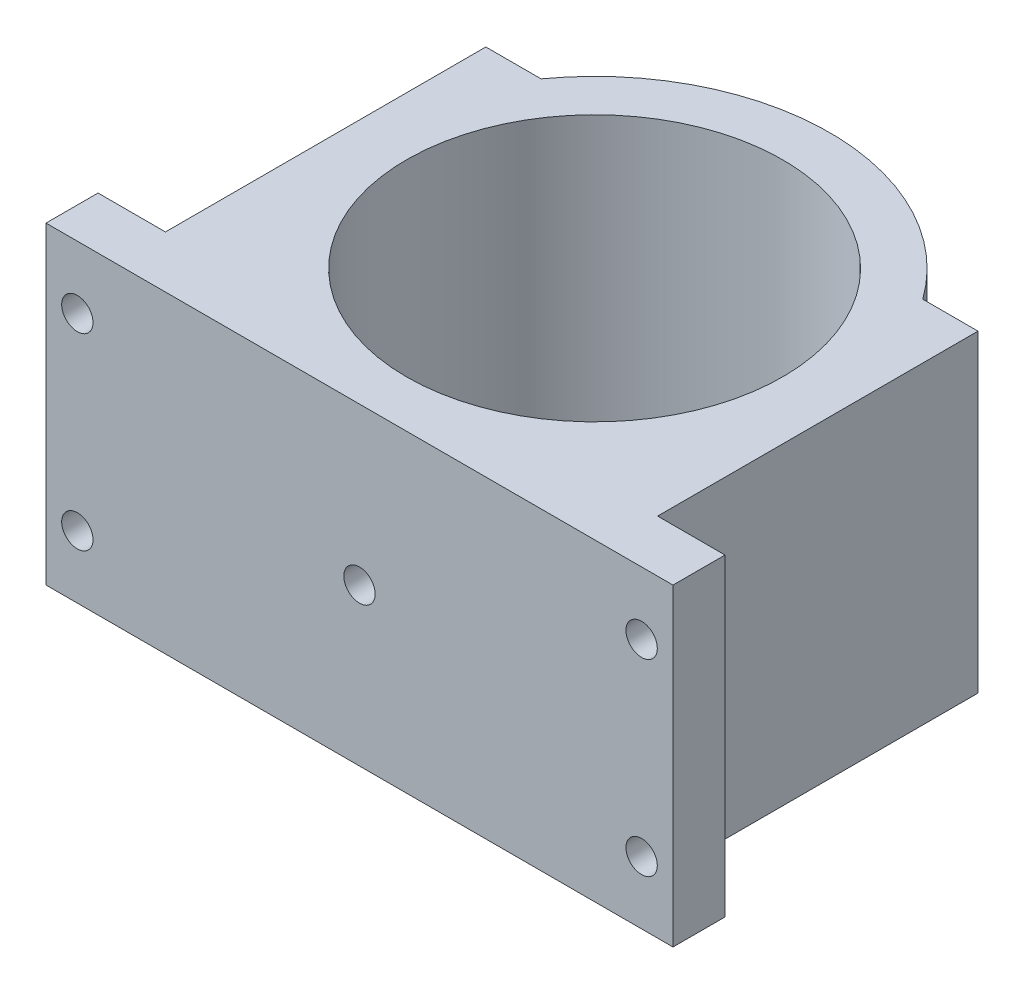
ISO-10303-21;
HEADER;
FILE_DESCRIPTION(('STEP AP214'),'2;1');
FILE_NAME('part.step','',(''),(''),'','','');
FILE_SCHEMA(('AUTOMOTIVE_DESIGN { 1 0 10303 214 1 1 1 1 }'));
ENDSEC;
DATA;
#1=APPLICATION_CONTEXT('core data for automotive mechanical design processes');
#2=APPLICATION_PROTOCOL_DEFINITION('international standard','automotive_design',2000,#1);
#3=PRODUCT_CONTEXT('',#1,'mechanical');
#4=PRODUCT('Part','Part','',(#3));
#5=PRODUCT_RELATED_PRODUCT_CATEGORY('part','',(#4));
#6=PRODUCT_DEFINITION_FORMATION('','',#4);
#7=PRODUCT_DEFINITION_CONTEXT('part definition',#1,'design');
#8=PRODUCT_DEFINITION('design','',#6,#7);
#9=PRODUCT_DEFINITION_SHAPE('','',#8);
#10=(LENGTH_UNIT() NAMED_UNIT(*) SI_UNIT(.MILLI.,.METRE.));
#11=(NAMED_UNIT(*) PLANE_ANGLE_UNIT() SI_UNIT($,.RADIAN.));
#12=(NAMED_UNIT(*) SI_UNIT($,.STERADIAN.) SOLID_ANGLE_UNIT());
#13=UNCERTAINTY_MEASURE_WITH_UNIT(LENGTH_MEASURE(1.E-05),#10,'distance_accuracy_value','');
#14=(GEOMETRIC_REPRESENTATION_CONTEXT(3) GLOBAL_UNCERTAINTY_ASSIGNED_CONTEXT((#13)) GLOBAL_UNIT_ASSIGNED_CONTEXT((#10,
#11,#12)) REPRESENTATION_CONTEXT('',''));
#15=CARTESIAN_POINT('',(0.,0.,0.));
#16=DIRECTION('',(0.,0.,1.));
#17=DIRECTION('',(1.,0.,0.));
#18=AXIS2_PLACEMENT_3D('',#15,#16,#17);
#19=CARTESIAN_POINT('',(0.,100.,0.));
#20=DIRECTION('',(0.,-1.,0.));
#21=DIRECTION('',(0.,0.,-1.));
#22=AXIS2_PLACEMENT_3D('',#19,#20,#21);
#23=PLANE('',#22);
#24=DIRECTION('',(0.,0.,1.));
#25=VECTOR('',#24,1.);
#26=CARTESIAN_POINT('',(-100.,100.,75.));
#27=LINE('',#26,#25);
#28=CARTESIAN_POINT('',(-100.,100.,58.4));
#29=VERTEX_POINT('',#28);
#30=CARTESIAN_POINT('',(-100.,100.,75.));
#31=VERTEX_POINT('',#30);
#32=EDGE_CURVE('E195',#29,#31,#27,.T.);
#33=ORIENTED_EDGE('',*,*,#32,.T.);
#34=DIRECTION('',(1.,0.,0.));
#35=VECTOR('',#34,1.);
#36=CARTESIAN_POINT('',(-100.,100.,75.));
#37=LINE('',#36,#35);
#38=CARTESIAN_POINT('',(100.,100.,75.));
#39=VERTEX_POINT('',#38);
#40=EDGE_CURVE('E114',#31,#39,#37,.T.);
#41=ORIENTED_EDGE('',*,*,#40,.T.);
#42=DIRECTION('',(0.,0.,-1.));
#43=VECTOR('',#42,1.);
#44=CARTESIAN_POINT('',(100.,100.,75.));
#45=LINE('',#44,#43);
#46=CARTESIAN_POINT('',(100.,100.,58.4));
#47=VERTEX_POINT('',#46);
#48=EDGE_CURVE('E225',#39,#47,#45,.T.);
#49=ORIENTED_EDGE('',*,*,#48,.T.);
#50=DIRECTION('',(-1.,0.,0.));
#51=VECTOR('',#50,1.);
#52=CARTESIAN_POINT('',(100.,100.,58.4));
#53=LINE('',#52,#51);
#54=CARTESIAN_POINT('',(78.5,100.,58.4));
#55=VERTEX_POINT('',#54);
#56=EDGE_CURVE('E242',#47,#55,#53,.T.);
#57=ORIENTED_EDGE('',*,*,#56,.T.);
#58=DIRECTION('',(0.,0.,-1.));
#59=VECTOR('',#58,1.);
#60=CARTESIAN_POINT('',(78.5,100.,58.4));
#61=LINE('',#60,#59);
#62=CARTESIAN_POINT('',(78.5,100.,-43.8));
#63=VERTEX_POINT('',#62);
#64=EDGE_CURVE('E240',#55,#63,#61,.T.);
#65=ORIENTED_EDGE('',*,*,#64,.T.);
#66=DIRECTION('',(-1.,0.,0.));
#67=VECTOR('',#66,1.);
#68=CARTESIAN_POINT('',(78.5,100.,-43.8));
#69=LINE('',#68,#67);
#70=CARTESIAN_POINT('',(60.8815242910359,100.,-43.8));
#71=VERTEX_POINT('',#70);
#72=EDGE_CURVE('E238',#63,#71,#69,.T.);
#73=ORIENTED_EDGE('',*,*,#72,.T.);
#74=CARTESIAN_POINT('',(0.,100.,0.));
#75=DIRECTION('',(0.,1.,0.));
#76=DIRECTION('',(0.,0.,-1.));
#77=AXIS2_PLACEMENT_3D('',#74,#75,#76);
#78=CIRCLE('',#77,75.);
#79=CARTESIAN_POINT('',(-60.881524291036,100.,-43.8));
#80=VERTEX_POINT('',#79);
#81=EDGE_CURVE('E136',#71,#80,#78,.T.);
#82=ORIENTED_EDGE('',*,*,#81,.T.);
#83=DIRECTION('',(-1.,0.,0.));
#84=VECTOR('',#83,1.);
#85=CARTESIAN_POINT('',(-78.5,100.,-43.8));
#86=LINE('',#85,#84);
#87=CARTESIAN_POINT('',(-78.5,100.,-43.8));
#88=VERTEX_POINT('',#87);
#89=EDGE_CURVE('E134',#80,#88,#86,.T.);
#90=ORIENTED_EDGE('',*,*,#89,.T.);
#91=DIRECTION('',(0.,0.,1.));
#92=VECTOR('',#91,1.);
#93=CARTESIAN_POINT('',(-78.5,100.,0.));
#94=LINE('',#93,#92);
#95=CARTESIAN_POINT('',(-78.5,100.,58.4));
#96=VERTEX_POINT('',#95);
#97=EDGE_CURVE('E140',#88,#96,#94,.T.);
#98=ORIENTED_EDGE('',*,*,#97,.T.);
#99=DIRECTION('',(-1.,0.,0.));
#100=VECTOR('',#99,1.);
#101=CARTESIAN_POINT('',(-100.,100.,58.4));
#102=LINE('',#101,#100);
#103=EDGE_CURVE('E61',#96,#29,#102,.T.);
#104=ORIENTED_EDGE('',*,*,#103,.T.);
#105=EDGE_LOOP('',(#33,#41,#49,#57,#65,#73,#82,#90,#98,#104));
#106=FACE_BOUND('',#105,.T.);
#107=CARTESIAN_POINT('',(0.,100.,0.));
#108=DIRECTION('',(0.,1.,0.));
#109=DIRECTION('',(0.,0.,1.));
#110=AXIS2_PLACEMENT_3D('',#107,#108,#109);
#111=CIRCLE('',#110,60.);
#112=CARTESIAN_POINT('',(0.,100.,60.));
#113=VERTEX_POINT('',#112);
#114=EDGE_CURVE('E170',#113,#113,#111,.T.);
#115=ORIENTED_EDGE('',*,*,#114,.F.);
#116=EDGE_LOOP('',(#115));
#117=FACE_BOUND('',#116,.T.);
#118=ADVANCED_FACE('F44',(#106,#117),#23,.F.);
#119=CARTESIAN_POINT('',(0.,0.,0.));
#120=DIRECTION('',(0.,-1.,0.));
#121=DIRECTION('',(0.,0.,-1.));
#122=AXIS2_PLACEMENT_3D('',#119,#120,#121);
#123=PLANE('',#122);
#124=DIRECTION('',(0.,0.,1.));
#125=VECTOR('',#124,1.);
#126=CARTESIAN_POINT('',(-100.,0.,75.));
#127=LINE('',#126,#125);
#128=CARTESIAN_POINT('',(-100.,0.,58.4));
#129=VERTEX_POINT('',#128);
#130=CARTESIAN_POINT('',(-100.,0.,75.));
#131=VERTEX_POINT('',#130);
#132=EDGE_CURVE('E165',#129,#131,#127,.T.);
#133=ORIENTED_EDGE('',*,*,#132,.F.);
#134=DIRECTION('',(-1.,0.,0.));
#135=VECTOR('',#134,1.);
#136=CARTESIAN_POINT('',(-100.,0.,58.4));
#137=LINE('',#136,#135);
#138=CARTESIAN_POINT('',(-78.5,0.,58.4));
#139=VERTEX_POINT('',#138);
#140=EDGE_CURVE('E104',#139,#129,#137,.T.);
#141=ORIENTED_EDGE('',*,*,#140,.F.);
#142=DIRECTION('',(0.,0.,1.));
#143=VECTOR('',#142,1.);
#144=CARTESIAN_POINT('',(-78.5,0.,58.4));
#145=LINE('',#144,#143);
#146=CARTESIAN_POINT('',(-78.5,0.,-43.8));
#147=VERTEX_POINT('',#146);
#148=EDGE_CURVE('E97',#147,#139,#145,.T.);
#149=ORIENTED_EDGE('',*,*,#148,.F.);
#150=DIRECTION('',(-1.,0.,0.));
#151=VECTOR('',#150,1.);
#152=CARTESIAN_POINT('',(-78.5,0.,-43.8));
#153=LINE('',#152,#151);
#154=CARTESIAN_POINT('',(-60.881524291036,0.,-43.8));
#155=VERTEX_POINT('',#154);
#156=EDGE_CURVE('E149',#155,#147,#153,.T.);
#157=ORIENTED_EDGE('',*,*,#156,.F.);
#158=CARTESIAN_POINT('',(0.,0.,0.));
#159=DIRECTION('',(0.,1.,0.));
#160=DIRECTION('',(0.,0.,-1.));
#161=AXIS2_PLACEMENT_3D('',#158,#159,#160);
#162=CIRCLE('',#161,75.);
#163=CARTESIAN_POINT('',(60.8815242910359,0.,-43.8));
#164=VERTEX_POINT('',#163);
#165=EDGE_CURVE('E181',#164,#155,#162,.T.);
#166=ORIENTED_EDGE('',*,*,#165,.F.);
#167=DIRECTION('',(-1.,0.,0.));
#168=VECTOR('',#167,1.);
#169=CARTESIAN_POINT('',(78.5,0.,-43.8));
#170=LINE('',#169,#168);
#171=CARTESIAN_POINT('',(78.5,0.,-43.8));
#172=VERTEX_POINT('',#171);
#173=EDGE_CURVE('E178',#172,#164,#170,.T.);
#174=ORIENTED_EDGE('',*,*,#173,.F.);
#175=DIRECTION('',(0.,0.,-1.));
#176=VECTOR('',#175,1.);
#177=CARTESIAN_POINT('',(78.5,0.,0.));
#178=LINE('',#177,#176);
#179=CARTESIAN_POINT('',(78.5,0.,58.4));
#180=VERTEX_POINT('',#179);
#181=EDGE_CURVE('E180',#180,#172,#178,.T.);
#182=ORIENTED_EDGE('',*,*,#181,.F.);
#183=DIRECTION('',(-1.,0.,0.));
#184=VECTOR('',#183,1.);
#185=CARTESIAN_POINT('',(100.,0.,58.4));
#186=LINE('',#185,#184);
#187=CARTESIAN_POINT('',(100.,0.,58.4));
#188=VERTEX_POINT('',#187);
#189=EDGE_CURVE('E174',#188,#180,#186,.T.);
#190=ORIENTED_EDGE('',*,*,#189,.F.);
#191=DIRECTION('',(0.,0.,-1.));
#192=VECTOR('',#191,1.);
#193=CARTESIAN_POINT('',(100.,0.,75.));
#194=LINE('',#193,#192);
#195=CARTESIAN_POINT('',(100.,0.,75.));
#196=VERTEX_POINT('',#195);
#197=EDGE_CURVE('E168',#196,#188,#194,.T.);
#198=ORIENTED_EDGE('',*,*,#197,.F.);
#199=DIRECTION('',(1.,0.,0.));
#200=VECTOR('',#199,1.);
#201=CARTESIAN_POINT('',(-100.,0.,75.));
#202=LINE('',#201,#200);
#203=EDGE_CURVE('E167',#131,#196,#202,.T.);
#204=ORIENTED_EDGE('',*,*,#203,.F.);
#205=EDGE_LOOP('',(#133,#141,#149,#157,#166,#174,#182,#190,#198,#204));
#206=FACE_BOUND('',#205,.T.);
#207=CARTESIAN_POINT('',(0.,0.,0.));
#208=DIRECTION('',(0.,1.,0.));
#209=DIRECTION('',(0.,0.,1.));
#210=AXIS2_PLACEMENT_3D('',#207,#208,#209);
#211=CIRCLE('',#210,60.);
#212=CARTESIAN_POINT('',(0.,0.,60.));
#213=VERTEX_POINT('',#212);
#214=EDGE_CURVE('E254',#213,#213,#211,.T.);
#215=ORIENTED_EDGE('',*,*,#214,.T.);
#216=EDGE_LOOP('',(#215));
#217=FACE_BOUND('',#216,.T.);
#218=ADVANCED_FACE('F227',(#206,#217),#123,.T.);
#219=CARTESIAN_POINT('',(-100.,100.,75.));
#220=DIRECTION('',(1.,0.,0.));
#221=DIRECTION('',(0.,0.,-1.));
#222=AXIS2_PLACEMENT_3D('',#219,#220,#221);
#223=PLANE('',#222);
#224=ORIENTED_EDGE('',*,*,#132,.T.);
#225=DIRECTION('',(0.,-1.,0.));
#226=VECTOR('',#225,1.);
#227=CARTESIAN_POINT('',(-100.,100.,75.));
#228=LINE('',#227,#226);
#229=EDGE_CURVE('E11',#31,#131,#228,.T.);
#230=ORIENTED_EDGE('',*,*,#229,.F.);
#231=ORIENTED_EDGE('',*,*,#32,.F.);
#232=DIRECTION('',(0.,-1.,0.));
#233=VECTOR('',#232,1.);
#234=CARTESIAN_POINT('',(-100.,100.,58.4));
#235=LINE('',#234,#233);
#236=EDGE_CURVE('E158',#29,#129,#235,.T.);
#237=ORIENTED_EDGE('',*,*,#236,.T.);
#238=EDGE_LOOP('',(#224,#230,#231,#237));
#239=FACE_BOUND('',#238,.T.);
#240=ADVANCED_FACE('F50',(#239),#223,.F.);
#241=CARTESIAN_POINT('',(-100.,100.,75.));
#242=DIRECTION('',(0.,0.,-1.));
#243=DIRECTION('',(-1.,0.,0.));
#244=AXIS2_PLACEMENT_3D('',#241,#242,#243);
#245=PLANE('',#244);
#246=CARTESIAN_POINT('',(0.,50.,75.));
#247=DIRECTION('',(0.,0.,1.));
#248=DIRECTION('',(1.,0.,0.));
#249=AXIS2_PLACEMENT_3D('',#246,#247,#248);
#250=CIRCLE('',#249,4.99999999999999);
#251=CARTESIAN_POINT('',(4.99999999999999,50.,75.));
#252=VERTEX_POINT('',#251);
#253=EDGE_CURVE('E294',#252,#252,#250,.T.);
#254=ORIENTED_EDGE('',*,*,#253,.F.);
#255=EDGE_LOOP('',(#254));
#256=FACE_BOUND('',#255,.T.);
#257=CARTESIAN_POINT('',(-90.,80.,75.));
#258=DIRECTION('',(0.,0.,1.));
#259=DIRECTION('',(1.,0.,0.));
#260=AXIS2_PLACEMENT_3D('',#257,#258,#259);
#261=CIRCLE('',#260,4.99999999999998);
#262=CARTESIAN_POINT('',(-85.,80.,75.));
#263=VERTEX_POINT('',#262);
#264=EDGE_CURVE('E287',#263,#263,#261,.T.);
#265=ORIENTED_EDGE('',*,*,#264,.F.);
#266=EDGE_LOOP('',(#265));
#267=FACE_BOUND('',#266,.T.);
#268=CARTESIAN_POINT('',(-90.,20.,75.));
#269=DIRECTION('',(0.,0.,1.));
#270=DIRECTION('',(1.,0.,0.));
#271=AXIS2_PLACEMENT_3D('',#268,#269,#270);
#272=CIRCLE('',#271,4.99999999999998);
#273=CARTESIAN_POINT('',(-85.,20.,75.));
#274=VERTEX_POINT('',#273);
#275=EDGE_CURVE('E285',#274,#274,#272,.T.);
#276=ORIENTED_EDGE('',*,*,#275,.F.);
#277=EDGE_LOOP('',(#276));
#278=FACE_BOUND('',#277,.T.);
#279=CARTESIAN_POINT('',(90.,20.,75.));
#280=DIRECTION('',(0.,0.,1.));
#281=DIRECTION('',(1.,0.,0.));
#282=AXIS2_PLACEMENT_3D('',#279,#280,#281);
#283=CIRCLE('',#282,4.99999999999998);
#284=CARTESIAN_POINT('',(95.,20.,75.));
#285=VERTEX_POINT('',#284);
#286=EDGE_CURVE('E273',#285,#285,#283,.T.);
#287=ORIENTED_EDGE('',*,*,#286,.F.);
#288=EDGE_LOOP('',(#287));
#289=FACE_BOUND('',#288,.T.);
#290=CARTESIAN_POINT('',(90.,80.,75.));
#291=DIRECTION('',(0.,0.,1.));
#292=DIRECTION('',(1.,0.,0.));
#293=AXIS2_PLACEMENT_3D('',#290,#291,#292);
#294=CIRCLE('',#293,4.99999999999998);
#295=CARTESIAN_POINT('',(95.,80.,75.));
#296=VERTEX_POINT('',#295);
#297=EDGE_CURVE('E266',#296,#296,#294,.T.);
#298=ORIENTED_EDGE('',*,*,#297,.F.);
#299=EDGE_LOOP('',(#298));
#300=FACE_BOUND('',#299,.T.);
#301=ORIENTED_EDGE('',*,*,#203,.T.);
#302=DIRECTION('',(0.,-1.,0.));
#303=VECTOR('',#302,1.);
#304=CARTESIAN_POINT('',(100.,100.,75.));
#305=LINE('',#304,#303);
#306=EDGE_CURVE('E57',#39,#196,#305,.T.);
#307=ORIENTED_EDGE('',*,*,#306,.F.);
#308=ORIENTED_EDGE('',*,*,#40,.F.);
#309=ORIENTED_EDGE('',*,*,#229,.T.);
#310=EDGE_LOOP('',(#301,#307,#308,#309));
#311=FACE_BOUND('',#310,.T.);
#312=ADVANCED_FACE('F302',(#256,#267,#278,#289,#300,#311),#245,.F.);
#313=CARTESIAN_POINT('',(100.,100.,75.));
#314=DIRECTION('',(-1.,0.,0.));
#315=DIRECTION('',(0.,0.,1.));
#316=AXIS2_PLACEMENT_3D('',#313,#314,#315);
#317=PLANE('',#316);
#318=ORIENTED_EDGE('',*,*,#197,.T.);
#319=DIRECTION('',(0.,-1.,0.));
#320=VECTOR('',#319,1.);
#321=CARTESIAN_POINT('',(100.,100.,58.4));
#322=LINE('',#321,#320);
#323=EDGE_CURVE('E211',#47,#188,#322,.T.);
#324=ORIENTED_EDGE('',*,*,#323,.F.);
#325=ORIENTED_EDGE('',*,*,#48,.F.);
#326=ORIENTED_EDGE('',*,*,#306,.T.);
#327=EDGE_LOOP('',(#318,#324,#325,#326));
#328=FACE_BOUND('',#327,.T.);
#329=ADVANCED_FACE('F219',(#328),#317,.F.);
#330=CARTESIAN_POINT('',(100.,100.,58.4));
#331=DIRECTION('',(0.,0.,1.));
#332=DIRECTION('',(1.,0.,0.));
#333=AXIS2_PLACEMENT_3D('',#330,#331,#332);
#334=PLANE('',#333);
#335=CARTESIAN_POINT('',(90.,20.,58.4));
#336=DIRECTION('',(0.,0.,1.));
#337=DIRECTION('',(1.,0.,0.));
#338=AXIS2_PLACEMENT_3D('',#335,#336,#337);
#339=CIRCLE('',#338,4.99999999999997);
#340=CARTESIAN_POINT('',(95.,20.,58.4));
#341=VERTEX_POINT('',#340);
#342=EDGE_CURVE('E269',#341,#341,#339,.T.);
#343=ORIENTED_EDGE('',*,*,#342,.T.);
#344=EDGE_LOOP('',(#343));
#345=FACE_BOUND('',#344,.T.);
#346=CARTESIAN_POINT('',(90.,80.,58.4));
#347=DIRECTION('',(0.,0.,1.));
#348=DIRECTION('',(1.,0.,0.));
#349=AXIS2_PLACEMENT_3D('',#346,#347,#348);
#350=CIRCLE('',#349,4.99999999999997);
#351=CARTESIAN_POINT('',(95.,80.,58.4));
#352=VERTEX_POINT('',#351);
#353=EDGE_CURVE('E259',#352,#352,#350,.T.);
#354=ORIENTED_EDGE('',*,*,#353,.T.);
#355=EDGE_LOOP('',(#354));
#356=FACE_BOUND('',#355,.T.);
#357=ORIENTED_EDGE('',*,*,#189,.T.);
#358=DIRECTION('',(0.,-1.,0.));
#359=VECTOR('',#358,1.);
#360=CARTESIAN_POINT('',(78.5,100.,58.4));
#361=LINE('',#360,#359);
#362=EDGE_CURVE('E210',#55,#180,#361,.T.);
#363=ORIENTED_EDGE('',*,*,#362,.F.);
#364=ORIENTED_EDGE('',*,*,#56,.F.);
#365=ORIENTED_EDGE('',*,*,#323,.T.);
#366=EDGE_LOOP('',(#357,#363,#364,#365));
#367=FACE_BOUND('',#366,.T.);
#368=ADVANCED_FACE('F232',(#345,#356,#367),#334,.F.);
#369=CARTESIAN_POINT('',(78.5,100.,0.));
#370=DIRECTION('',(-1.,0.,0.));
#371=DIRECTION('',(0.,0.,1.));
#372=AXIS2_PLACEMENT_3D('',#369,#370,#371);
#373=PLANE('',#372);
#374=ORIENTED_EDGE('',*,*,#181,.T.);
#375=DIRECTION('',(0.,-1.,0.));
#376=VECTOR('',#375,1.);
#377=CARTESIAN_POINT('',(78.5,100.,-43.8));
#378=LINE('',#377,#376);
#379=EDGE_CURVE('E201',#63,#172,#378,.T.);
#380=ORIENTED_EDGE('',*,*,#379,.F.);
#381=ORIENTED_EDGE('',*,*,#64,.F.);
#382=ORIENTED_EDGE('',*,*,#362,.T.);
#383=EDGE_LOOP('',(#374,#380,#381,#382));
#384=FACE_BOUND('',#383,.T.);
#385=ADVANCED_FACE('F233',(#384),#373,.F.);
#386=CARTESIAN_POINT('',(78.5,100.,-43.8));
#387=DIRECTION('',(0.,0.,1.));
#388=DIRECTION('',(1.,0.,0.));
#389=AXIS2_PLACEMENT_3D('',#386,#387,#388);
#390=PLANE('',#389);
#391=ORIENTED_EDGE('',*,*,#173,.T.);
#392=DIRECTION('',(0.,-1.,0.));
#393=VECTOR('',#392,1.);
#394=CARTESIAN_POINT('',(60.8815242910359,100.,-43.8));
#395=LINE('',#394,#393);
#396=EDGE_CURVE('E200',#71,#164,#395,.T.);
#397=ORIENTED_EDGE('',*,*,#396,.F.);
#398=ORIENTED_EDGE('',*,*,#72,.F.);
#399=ORIENTED_EDGE('',*,*,#379,.T.);
#400=EDGE_LOOP('',(#391,#397,#398,#399));
#401=FACE_BOUND('',#400,.T.);
#402=ADVANCED_FACE('F317',(#401),#390,.F.);
#403=CARTESIAN_POINT('',(0.,100.,0.));
#404=DIRECTION('',(0.,-1.,0.));
#405=DIRECTION('',(0.,0.,-1.));
#406=AXIS2_PLACEMENT_3D('',#403,#404,#405);
#407=CYLINDRICAL_SURFACE('',#406,75.);
#408=ORIENTED_EDGE('',*,*,#165,.T.);
#409=DIRECTION('',(0.,-1.,0.));
#410=VECTOR('',#409,1.);
#411=CARTESIAN_POINT('',(-60.881524291036,100.,-43.8));
#412=LINE('',#411,#410);
#413=EDGE_CURVE('E151',#80,#155,#412,.T.);
#414=ORIENTED_EDGE('',*,*,#413,.F.);
#415=ORIENTED_EDGE('',*,*,#81,.F.);
#416=ORIENTED_EDGE('',*,*,#396,.T.);
#417=EDGE_LOOP('',(#408,#414,#415,#416));
#418=FACE_BOUND('',#417,.T.);
#419=ADVANCED_FACE('F316',(#418),#407,.T.);
#420=CARTESIAN_POINT('',(-78.5,100.,-43.8));
#421=DIRECTION('',(0.,0.,1.));
#422=DIRECTION('',(1.,0.,0.));
#423=AXIS2_PLACEMENT_3D('',#420,#421,#422);
#424=PLANE('',#423);
#425=ORIENTED_EDGE('',*,*,#156,.T.);
#426=DIRECTION('',(0.,-1.,0.));
#427=VECTOR('',#426,1.);
#428=CARTESIAN_POINT('',(-78.5,100.,-43.8));
#429=LINE('',#428,#427);
#430=EDGE_CURVE('E148',#88,#147,#429,.T.);
#431=ORIENTED_EDGE('',*,*,#430,.F.);
#432=ORIENTED_EDGE('',*,*,#89,.F.);
#433=ORIENTED_EDGE('',*,*,#413,.T.);
#434=EDGE_LOOP('',(#425,#431,#432,#433));
#435=FACE_BOUND('',#434,.T.);
#436=ADVANCED_FACE('F150',(#435),#424,.F.);
#437=CARTESIAN_POINT('',(-78.5,100.,58.4));
#438=DIRECTION('',(1.,0.,0.));
#439=DIRECTION('',(0.,0.,-1.));
#440=AXIS2_PLACEMENT_3D('',#437,#438,#439);
#441=PLANE('',#440);
#442=ORIENTED_EDGE('',*,*,#148,.T.);
#443=DIRECTION('',(0.,-1.,0.));
#444=VECTOR('',#443,1.);
#445=CARTESIAN_POINT('',(-78.5,100.,58.4));
#446=LINE('',#445,#444);
#447=EDGE_CURVE('E155',#96,#139,#446,.T.);
#448=ORIENTED_EDGE('',*,*,#447,.F.);
#449=ORIENTED_EDGE('',*,*,#97,.F.);
#450=ORIENTED_EDGE('',*,*,#430,.T.);
#451=EDGE_LOOP('',(#442,#448,#449,#450));
#452=FACE_BOUND('',#451,.T.);
#453=ADVANCED_FACE('F152',(#452),#441,.F.);
#454=CARTESIAN_POINT('',(-100.,100.,58.4));
#455=DIRECTION('',(0.,0.,1.));
#456=DIRECTION('',(1.,0.,0.));
#457=AXIS2_PLACEMENT_3D('',#454,#455,#456);
#458=PLANE('',#457);
#459=CARTESIAN_POINT('',(-90.,80.,58.4));
#460=DIRECTION('',(0.,0.,1.));
#461=DIRECTION('',(1.,0.,0.));
#462=AXIS2_PLACEMENT_3D('',#459,#460,#461);
#463=CIRCLE('',#462,4.99999999999997);
#464=CARTESIAN_POINT('',(-85.,80.,58.4));
#465=VERTEX_POINT('',#464);
#466=EDGE_CURVE('E47',#465,#465,#463,.T.);
#467=ORIENTED_EDGE('',*,*,#466,.T.);
#468=EDGE_LOOP('',(#467));
#469=FACE_BOUND('',#468,.T.);
#470=CARTESIAN_POINT('',(-90.,20.,58.4));
#471=DIRECTION('',(0.,0.,1.));
#472=DIRECTION('',(1.,0.,0.));
#473=AXIS2_PLACEMENT_3D('',#470,#471,#472);
#474=CIRCLE('',#473,4.99999999999997);
#475=CARTESIAN_POINT('',(-85.,20.,58.4));
#476=VERTEX_POINT('',#475);
#477=EDGE_CURVE('E279',#476,#476,#474,.T.);
#478=ORIENTED_EDGE('',*,*,#477,.T.);
#479=EDGE_LOOP('',(#478));
#480=FACE_BOUND('',#479,.T.);
#481=ORIENTED_EDGE('',*,*,#140,.T.);
#482=ORIENTED_EDGE('',*,*,#236,.F.);
#483=ORIENTED_EDGE('',*,*,#103,.F.);
#484=ORIENTED_EDGE('',*,*,#447,.T.);
#485=EDGE_LOOP('',(#481,#482,#483,#484));
#486=FACE_BOUND('',#485,.T.);
#487=ADVANCED_FACE('F339',(#469,#480,#486),#458,.F.);
#488=CARTESIAN_POINT('',(0.,100.,0.));
#489=DIRECTION('',(0.,-1.,0.));
#490=DIRECTION('',(0.,0.,-1.));
#491=AXIS2_PLACEMENT_3D('',#488,#489,#490);
#492=CYLINDRICAL_SURFACE('',#491,60.);
#493=ORIENTED_EDGE('',*,*,#114,.T.);
#494=EDGE_LOOP('',(#493));
#495=FACE_BOUND('',#494,.T.);
#496=ORIENTED_EDGE('',*,*,#214,.F.);
#497=EDGE_LOOP('',(#496));
#498=FACE_BOUND('',#497,.T.);
#499=ADVANCED_FACE('F333',(#495,#498),#492,.F.);
#500=CARTESIAN_POINT('',(90.,80.,75.));
#501=DIRECTION('',(0.,0.,1.));
#502=DIRECTION('',(1.,0.,0.));
#503=AXIS2_PLACEMENT_3D('',#500,#501,#502);
#504=CYLINDRICAL_SURFACE('',#503,4.99999999999997);
#505=ORIENTED_EDGE('',*,*,#297,.T.);
#506=EDGE_LOOP('',(#505));
#507=FACE_BOUND('',#506,.T.);
#508=ORIENTED_EDGE('',*,*,#353,.F.);
#509=EDGE_LOOP('',(#508));
#510=FACE_BOUND('',#509,.T.);
#511=ADVANCED_FACE('F362',(#507,#510),#504,.F.);
#512=CARTESIAN_POINT('',(90.,20.,75.));
#513=DIRECTION('',(0.,0.,1.));
#514=DIRECTION('',(1.,0.,0.));
#515=AXIS2_PLACEMENT_3D('',#512,#513,#514);
#516=CYLINDRICAL_SURFACE('',#515,4.99999999999997);
#517=ORIENTED_EDGE('',*,*,#286,.T.);
#518=EDGE_LOOP('',(#517));
#519=FACE_BOUND('',#518,.T.);
#520=ORIENTED_EDGE('',*,*,#342,.F.);
#521=EDGE_LOOP('',(#520));
#522=FACE_BOUND('',#521,.T.);
#523=ADVANCED_FACE('F383',(#519,#522),#516,.F.);
#524=CARTESIAN_POINT('',(-90.,20.,75.));
#525=DIRECTION('',(0.,0.,1.));
#526=DIRECTION('',(1.,0.,0.));
#527=AXIS2_PLACEMENT_3D('',#524,#525,#526);
#528=CYLINDRICAL_SURFACE('',#527,4.99999999999997);
#529=ORIENTED_EDGE('',*,*,#275,.T.);
#530=EDGE_LOOP('',(#529));
#531=FACE_BOUND('',#530,.T.);
#532=ORIENTED_EDGE('',*,*,#477,.F.);
#533=EDGE_LOOP('',(#532));
#534=FACE_BOUND('',#533,.T.);
#535=ADVANCED_FACE('F395',(#531,#534),#528,.F.);
#536=CARTESIAN_POINT('',(-90.,80.,75.));
#537=DIRECTION('',(0.,0.,1.));
#538=DIRECTION('',(1.,0.,0.));
#539=AXIS2_PLACEMENT_3D('',#536,#537,#538);
#540=CYLINDRICAL_SURFACE('',#539,4.99999999999997);
#541=ORIENTED_EDGE('',*,*,#264,.T.);
#542=EDGE_LOOP('',(#541));
#543=FACE_BOUND('',#542,.T.);
#544=ORIENTED_EDGE('',*,*,#466,.F.);
#545=EDGE_LOOP('',(#544));
#546=FACE_BOUND('',#545,.T.);
#547=ADVANCED_FACE('F402',(#543,#546),#540,.F.);
#548=CARTESIAN_POINT('',(0.,50.,67.));
#549=DIRECTION('',(0.,0.,1.));
#550=DIRECTION('',(1.,0.,0.));
#551=AXIS2_PLACEMENT_3D('',#548,#549,#550);
#552=CONICAL_SURFACE('',#551,5.,1.02974425867665);
#553=CARTESIAN_POINT('',(0.,50.,63.9956969048622));
#554=VERTEX_POINT('',#553);
#555=VERTEX_LOOP('',#554);
#556=FACE_BOUND('',#555,.T.);
#557=CARTESIAN_POINT('',(0.,50.,67.));
#558=DIRECTION('',(0.,0.,1.));
#559=DIRECTION('',(1.,0.,0.));
#560=AXIS2_PLACEMENT_3D('',#557,#558,#559);
#561=CIRCLE('',#560,5.);
#562=CARTESIAN_POINT('',(5.,50.,67.));
#563=VERTEX_POINT('',#562);
#564=EDGE_CURVE('E288',#563,#563,#561,.T.);
#565=ORIENTED_EDGE('',*,*,#564,.T.);
#566=EDGE_LOOP('',(#565));
#567=FACE_BOUND('',#566,.T.);
#568=ADVANCED_FACE('F406',(#556,#567),#552,.F.);
#569=CARTESIAN_POINT('',(0.,50.,75.));
#570=DIRECTION('',(0.,0.,1.));
#571=DIRECTION('',(1.,0.,0.));
#572=AXIS2_PLACEMENT_3D('',#569,#570,#571);
#573=CYLINDRICAL_SURFACE('',#572,4.99999999999999);
#574=ORIENTED_EDGE('',*,*,#564,.F.);
#575=EDGE_LOOP('',(#574));
#576=FACE_BOUND('',#575,.T.);
#577=ORIENTED_EDGE('',*,*,#253,.T.);
#578=EDGE_LOOP('',(#577));
#579=FACE_BOUND('',#578,.T.);
#580=ADVANCED_FACE('F296',(#576,#579),#573,.F.);
#581=CLOSED_SHELL('',(#118,#218,#240,#312,#329,#368,#385,#402,#419,#436,#453,#487,#499,#511,
#523,#535,#547,#568,#580));
#582=MANIFOLD_SOLID_BREP('B2',#581);
#583=ADVANCED_BREP_SHAPE_REPRESENTATION('',(#18,#582),#14);
#584=SHAPE_DEFINITION_REPRESENTATION(#9,#583);
ENDSEC;
END-ISO-10303-21;
